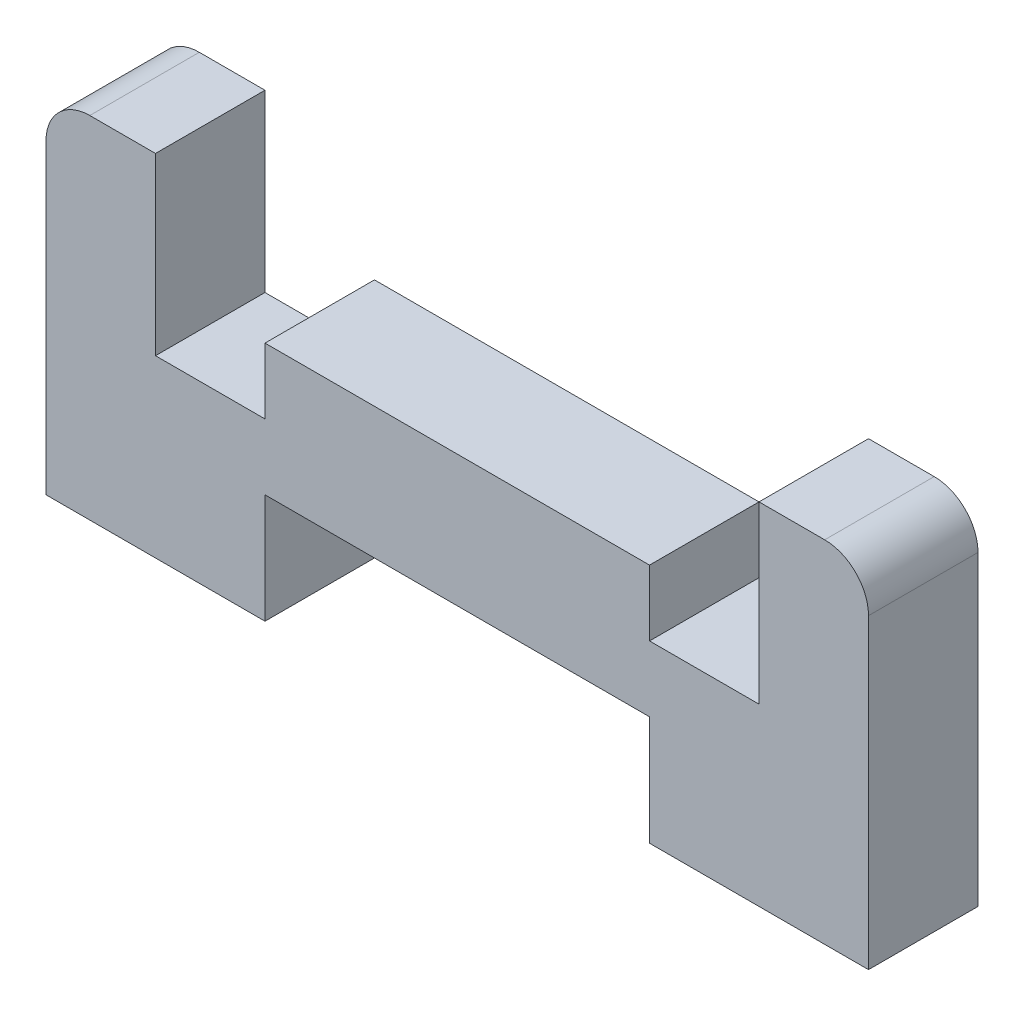
ISO-10303-21;
HEADER;
FILE_DESCRIPTION(('STEP AP214'),'2;1');
FILE_NAME('part.step','',(''),(''),'','','');
FILE_SCHEMA(('AUTOMOTIVE_DESIGN { 1 0 10303 214 1 1 1 1 }'));
ENDSEC;
DATA;
#1=APPLICATION_CONTEXT('core data for automotive mechanical design processes');
#2=APPLICATION_PROTOCOL_DEFINITION('international standard','automotive_design',2000,#1);
#3=PRODUCT_CONTEXT('',#1,'mechanical');
#4=PRODUCT('Part','Part','',(#3));
#5=PRODUCT_RELATED_PRODUCT_CATEGORY('part','',(#4));
#6=PRODUCT_DEFINITION_FORMATION('','',#4);
#7=PRODUCT_DEFINITION_CONTEXT('part definition',#1,'design');
#8=PRODUCT_DEFINITION('design','',#6,#7);
#9=PRODUCT_DEFINITION_SHAPE('','',#8);
#10=(LENGTH_UNIT() NAMED_UNIT(*) SI_UNIT(.MILLI.,.METRE.));
#11=(NAMED_UNIT(*) PLANE_ANGLE_UNIT() SI_UNIT($,.RADIAN.));
#12=(NAMED_UNIT(*) SI_UNIT($,.STERADIAN.) SOLID_ANGLE_UNIT());
#13=UNCERTAINTY_MEASURE_WITH_UNIT(LENGTH_MEASURE(1.E-05),#10,'distance_accuracy_value','');
#14=(GEOMETRIC_REPRESENTATION_CONTEXT(3) GLOBAL_UNCERTAINTY_ASSIGNED_CONTEXT((#13)) GLOBAL_UNIT_ASSIGNED_CONTEXT((#10,
#11,#12)) REPRESENTATION_CONTEXT('',''));
#15=CARTESIAN_POINT('',(0.,0.,0.));
#16=DIRECTION('',(0.,0.,1.));
#17=DIRECTION('',(1.,0.,0.));
#18=AXIS2_PLACEMENT_3D('',#15,#16,#17);
#19=CARTESIAN_POINT('',(-17.5006,0.,6.35));
#20=DIRECTION('',(-1.,0.,0.));
#21=DIRECTION('',(0.,-1.,0.));
#22=AXIS2_PLACEMENT_3D('',#19,#20,#21);
#23=PLANE('',#22);
#24=DIRECTION('',(0.,1.,0.));
#25=VECTOR('',#24,1.);
#26=CARTESIAN_POINT('',(-17.5006,0.,0.));
#27=LINE('',#26,#25);
#28=CARTESIAN_POINT('',(-17.5006,-3.81,0.));
#29=VERTEX_POINT('',#28);
#30=CARTESIAN_POINT('',(-17.5006,6.35,0.));
#31=VERTEX_POINT('',#30);
#32=EDGE_CURVE('E119',#29,#31,#27,.T.);
#33=ORIENTED_EDGE('',*,*,#32,.T.);
#34=DIRECTION('',(0.,0.,-1.));
#35=VECTOR('',#34,1.);
#36=CARTESIAN_POINT('',(-17.5006,6.35,6.35));
#37=LINE('',#36,#35);
#38=CARTESIAN_POINT('',(-17.5006,6.35,6.35));
#39=VERTEX_POINT('',#38);
#40=EDGE_CURVE('E11',#39,#31,#37,.T.);
#41=ORIENTED_EDGE('',*,*,#40,.F.);
#42=DIRECTION('',(0.,1.,0.));
#43=VECTOR('',#42,1.);
#44=CARTESIAN_POINT('',(-17.5006,0.,6.35));
#45=LINE('',#44,#43);
#46=CARTESIAN_POINT('',(-17.5006,-3.81,6.35));
#47=VERTEX_POINT('',#46);
#48=EDGE_CURVE('E125',#47,#39,#45,.T.);
#49=ORIENTED_EDGE('',*,*,#48,.F.);
#50=DIRECTION('',(0.,0.,-1.));
#51=VECTOR('',#50,1.);
#52=CARTESIAN_POINT('',(-17.5006,-3.81,6.35));
#53=LINE('',#52,#51);
#54=EDGE_CURVE('E189',#47,#29,#53,.T.);
#55=ORIENTED_EDGE('',*,*,#54,.T.);
#56=EDGE_LOOP('',(#33,#41,#49,#55));
#57=FACE_BOUND('',#56,.T.);
#58=ADVANCED_FACE('F37',(#57),#23,.F.);
#59=CARTESIAN_POINT('',(-17.5006,6.35,6.35));
#60=DIRECTION('',(0.,-1.,0.));
#61=DIRECTION('',(1.,0.,0.));
#62=AXIS2_PLACEMENT_3D('',#59,#60,#61);
#63=PLANE('',#62);
#64=DIRECTION('',(-1.,0.,0.));
#65=VECTOR('',#64,1.);
#66=CARTESIAN_POINT('',(-17.5006,6.35,0.));
#67=LINE('',#66,#65);
#68=CARTESIAN_POINT('',(-21.3106,6.35,0.));
#69=VERTEX_POINT('',#68);
#70=EDGE_CURVE('E194',#31,#69,#67,.T.);
#71=ORIENTED_EDGE('',*,*,#70,.T.);
#72=DIRECTION('',(0.,0.,-1.));
#73=VECTOR('',#72,1.);
#74=CARTESIAN_POINT('',(-21.3106,6.35,6.35));
#75=LINE('',#74,#73);
#76=CARTESIAN_POINT('',(-21.3106,6.35,6.35));
#77=VERTEX_POINT('',#76);
#78=EDGE_CURVE('E45',#77,#69,#75,.T.);
#79=ORIENTED_EDGE('',*,*,#78,.F.);
#80=DIRECTION('',(-1.,0.,0.));
#81=VECTOR('',#80,1.);
#82=CARTESIAN_POINT('',(-17.5006,6.35,6.35));
#83=LINE('',#82,#81);
#84=EDGE_CURVE('E326',#39,#77,#83,.T.);
#85=ORIENTED_EDGE('',*,*,#84,.F.);
#86=ORIENTED_EDGE('',*,*,#40,.T.);
#87=EDGE_LOOP('',(#71,#79,#85,#86));
#88=FACE_BOUND('',#87,.T.);
#89=ADVANCED_FACE('F329',(#88),#63,.F.);
#90=CARTESIAN_POINT('',(-21.3106,3.81,6.35));
#91=DIRECTION('',(0.,0.,-1.));
#92=DIRECTION('',(-1.,0.,0.));
#93=AXIS2_PLACEMENT_3D('',#90,#91,#92);
#94=CYLINDRICAL_SURFACE('',#93,2.54);
#95=CARTESIAN_POINT('',(-21.3106,3.81,0.));
#96=DIRECTION('',(0.,0.,1.));
#97=DIRECTION('',(1.,0.,0.));
#98=AXIS2_PLACEMENT_3D('',#95,#96,#97);
#99=CIRCLE('',#98,2.54);
#100=CARTESIAN_POINT('',(-23.8506,3.81,0.));
#101=VERTEX_POINT('',#100);
#102=EDGE_CURVE('E196',#69,#101,#99,.T.);
#103=ORIENTED_EDGE('',*,*,#102,.T.);
#104=DIRECTION('',(0.,0.,-1.));
#105=VECTOR('',#104,1.);
#106=CARTESIAN_POINT('',(-23.8506,3.81,6.35));
#107=LINE('',#106,#105);
#108=CARTESIAN_POINT('',(-23.8506,3.81,6.35));
#109=VERTEX_POINT('',#108);
#110=EDGE_CURVE('E266',#109,#101,#107,.T.);
#111=ORIENTED_EDGE('',*,*,#110,.F.);
#112=CARTESIAN_POINT('',(-21.3106,3.81,6.35));
#113=DIRECTION('',(0.,0.,1.));
#114=DIRECTION('',(1.,0.,0.));
#115=AXIS2_PLACEMENT_3D('',#112,#113,#114);
#116=CIRCLE('',#115,2.54);
#117=EDGE_CURVE('E275',#77,#109,#116,.T.);
#118=ORIENTED_EDGE('',*,*,#117,.F.);
#119=ORIENTED_EDGE('',*,*,#78,.T.);
#120=EDGE_LOOP('',(#103,#111,#118,#119));
#121=FACE_BOUND('',#120,.T.);
#122=ADVANCED_FACE('F273',(#121),#94,.T.);
#123=CARTESIAN_POINT('',(-23.8506,-7.61999999999999,6.35));
#124=DIRECTION('',(1.,0.,0.));
#125=DIRECTION('',(0.,1.,0.));
#126=AXIS2_PLACEMENT_3D('',#123,#124,#125);
#127=PLANE('',#126);
#128=DIRECTION('',(0.,-1.,0.));
#129=VECTOR('',#128,1.);
#130=CARTESIAN_POINT('',(-23.8506,-7.61999999999999,0.));
#131=LINE('',#130,#129);
#132=CARTESIAN_POINT('',(-23.8506,-13.97,0.));
#133=VERTEX_POINT('',#132);
#134=EDGE_CURVE('E199',#101,#133,#131,.T.);
#135=ORIENTED_EDGE('',*,*,#134,.T.);
#136=DIRECTION('',(0.,0.,-1.));
#137=VECTOR('',#136,1.);
#138=CARTESIAN_POINT('',(-23.8506,-13.97,6.35));
#139=LINE('',#138,#137);
#140=CARTESIAN_POINT('',(-23.8506,-13.97,6.35));
#141=VERTEX_POINT('',#140);
#142=EDGE_CURVE('E263',#141,#133,#139,.T.);
#143=ORIENTED_EDGE('',*,*,#142,.F.);
#144=DIRECTION('',(0.,-1.,0.));
#145=VECTOR('',#144,1.);
#146=CARTESIAN_POINT('',(-23.8506,3.81,6.35));
#147=LINE('',#146,#145);
#148=EDGE_CURVE('E292',#109,#141,#147,.T.);
#149=ORIENTED_EDGE('',*,*,#148,.F.);
#150=ORIENTED_EDGE('',*,*,#110,.T.);
#151=EDGE_LOOP('',(#135,#143,#149,#150));
#152=FACE_BOUND('',#151,.T.);
#153=ADVANCED_FACE('F283',(#152),#127,.F.);
#154=CARTESIAN_POINT('',(-23.8506,-13.97,6.35));
#155=DIRECTION('',(0.,1.,0.));
#156=DIRECTION('',(0.,0.,1.));
#157=AXIS2_PLACEMENT_3D('',#154,#155,#156);
#158=PLANE('',#157);
#159=DIRECTION('',(1.,0.,0.));
#160=VECTOR('',#159,1.);
#161=CARTESIAN_POINT('',(-23.8506,-13.97,0.));
#162=LINE('',#161,#160);
#163=CARTESIAN_POINT('',(-11.1506,-13.97,0.));
#164=VERTEX_POINT('',#163);
#165=EDGE_CURVE('E201',#133,#164,#162,.T.);
#166=ORIENTED_EDGE('',*,*,#165,.T.);
#167=DIRECTION('',(0.,0.,-1.));
#168=VECTOR('',#167,1.);
#169=CARTESIAN_POINT('',(-11.1506,-13.97,6.35));
#170=LINE('',#169,#168);
#171=CARTESIAN_POINT('',(-11.1506,-13.97,6.35));
#172=VERTEX_POINT('',#171);
#173=EDGE_CURVE('E260',#172,#164,#170,.T.);
#174=ORIENTED_EDGE('',*,*,#173,.F.);
#175=DIRECTION('',(1.,0.,0.));
#176=VECTOR('',#175,1.);
#177=CARTESIAN_POINT('',(-23.8506,-13.97,6.35));
#178=LINE('',#177,#176);
#179=EDGE_CURVE('E289',#141,#172,#178,.T.);
#180=ORIENTED_EDGE('',*,*,#179,.F.);
#181=ORIENTED_EDGE('',*,*,#142,.T.);
#182=EDGE_LOOP('',(#166,#174,#180,#181));
#183=FACE_BOUND('',#182,.T.);
#184=ADVANCED_FACE('F287',(#183),#158,.F.);
#185=CARTESIAN_POINT('',(-11.1506,-13.97,6.35));
#186=DIRECTION('',(-1.,0.,0.));
#187=DIRECTION('',(0.,-1.,0.));
#188=AXIS2_PLACEMENT_3D('',#185,#186,#187);
#189=PLANE('',#188);
#190=DIRECTION('',(0.,1.,0.));
#191=VECTOR('',#190,1.);
#192=CARTESIAN_POINT('',(-11.1506,-13.97,0.));
#193=LINE('',#192,#191);
#194=CARTESIAN_POINT('',(-11.1506,-7.62000000000001,0.));
#195=VERTEX_POINT('',#194);
#196=EDGE_CURVE('E203',#164,#195,#193,.T.);
#197=ORIENTED_EDGE('',*,*,#196,.T.);
#198=DIRECTION('',(0.,0.,-1.));
#199=VECTOR('',#198,1.);
#200=CARTESIAN_POINT('',(-11.1506,-7.62000000000001,6.35));
#201=LINE('',#200,#199);
#202=CARTESIAN_POINT('',(-11.1506,-7.62000000000001,6.35));
#203=VERTEX_POINT('',#202);
#204=EDGE_CURVE('E257',#203,#195,#201,.T.);
#205=ORIENTED_EDGE('',*,*,#204,.F.);
#206=DIRECTION('',(0.,1.,0.));
#207=VECTOR('',#206,1.);
#208=CARTESIAN_POINT('',(-11.1506,-13.97,6.35));
#209=LINE('',#208,#207);
#210=EDGE_CURVE('E291',#172,#203,#209,.T.);
#211=ORIENTED_EDGE('',*,*,#210,.F.);
#212=ORIENTED_EDGE('',*,*,#173,.T.);
#213=EDGE_LOOP('',(#197,#205,#211,#212));
#214=FACE_BOUND('',#213,.T.);
#215=ADVANCED_FACE('F341',(#214),#189,.F.);
#216=CARTESIAN_POINT('',(-11.1506,-7.62000000000001,6.35));
#217=DIRECTION('',(0.,1.,0.));
#218=DIRECTION('',(-1.,0.,0.));
#219=AXIS2_PLACEMENT_3D('',#216,#217,#218);
#220=PLANE('',#219);
#221=DIRECTION('',(1.,0.,0.));
#222=VECTOR('',#221,1.);
#223=CARTESIAN_POINT('',(-11.1506,-7.62000000000001,0.));
#224=LINE('',#223,#222);
#225=CARTESIAN_POINT('',(11.1506,-7.62,0.));
#226=VERTEX_POINT('',#225);
#227=EDGE_CURVE('E205',#195,#226,#224,.T.);
#228=ORIENTED_EDGE('',*,*,#227,.T.);
#229=DIRECTION('',(0.,0.,-1.));
#230=VECTOR('',#229,1.);
#231=CARTESIAN_POINT('',(11.1506,-7.62,6.35));
#232=LINE('',#231,#230);
#233=CARTESIAN_POINT('',(11.1506,-7.62,6.35));
#234=VERTEX_POINT('',#233);
#235=EDGE_CURVE('E254',#234,#226,#232,.T.);
#236=ORIENTED_EDGE('',*,*,#235,.F.);
#237=DIRECTION('',(1.,0.,0.));
#238=VECTOR('',#237,1.);
#239=CARTESIAN_POINT('',(-11.1506,-7.62000000000001,6.35));
#240=LINE('',#239,#238);
#241=EDGE_CURVE('E294',#203,#234,#240,.T.);
#242=ORIENTED_EDGE('',*,*,#241,.F.);
#243=ORIENTED_EDGE('',*,*,#204,.T.);
#244=EDGE_LOOP('',(#228,#236,#242,#243));
#245=FACE_BOUND('',#244,.T.);
#246=ADVANCED_FACE('F344',(#245),#220,.F.);
#247=CARTESIAN_POINT('',(11.1506,-13.97,6.35));
#248=DIRECTION('',(1.,0.,0.));
#249=DIRECTION('',(0.,1.,0.));
#250=AXIS2_PLACEMENT_3D('',#247,#248,#249);
#251=PLANE('',#250);
#252=DIRECTION('',(0.,-1.,0.));
#253=VECTOR('',#252,1.);
#254=CARTESIAN_POINT('',(11.1506,-13.97,0.));
#255=LINE('',#254,#253);
#256=CARTESIAN_POINT('',(11.1506,-13.97,0.));
#257=VERTEX_POINT('',#256);
#258=EDGE_CURVE('E207',#226,#257,#255,.T.);
#259=ORIENTED_EDGE('',*,*,#258,.T.);
#260=DIRECTION('',(0.,0.,-1.));
#261=VECTOR('',#260,1.);
#262=CARTESIAN_POINT('',(11.1506,-13.97,6.35));
#263=LINE('',#262,#261);
#264=CARTESIAN_POINT('',(11.1506,-13.97,6.35));
#265=VERTEX_POINT('',#264);
#266=EDGE_CURVE('E251',#265,#257,#263,.T.);
#267=ORIENTED_EDGE('',*,*,#266,.F.);
#268=DIRECTION('',(0.,-1.,0.));
#269=VECTOR('',#268,1.);
#270=CARTESIAN_POINT('',(11.1506,-13.97,6.35));
#271=LINE('',#270,#269);
#272=EDGE_CURVE('E300',#234,#265,#271,.T.);
#273=ORIENTED_EDGE('',*,*,#272,.F.);
#274=ORIENTED_EDGE('',*,*,#235,.T.);
#275=EDGE_LOOP('',(#259,#267,#273,#274));
#276=FACE_BOUND('',#275,.T.);
#277=ADVANCED_FACE('F348',(#276),#251,.F.);
#278=CARTESIAN_POINT('',(11.1506,-13.97,6.35));
#279=DIRECTION('',(0.,1.,0.));
#280=DIRECTION('',(0.,0.,1.));
#281=AXIS2_PLACEMENT_3D('',#278,#279,#280);
#282=PLANE('',#281);
#283=DIRECTION('',(1.,0.,0.));
#284=VECTOR('',#283,1.);
#285=CARTESIAN_POINT('',(11.1506,-13.97,0.));
#286=LINE('',#285,#284);
#287=CARTESIAN_POINT('',(23.8506,-13.97,0.));
#288=VERTEX_POINT('',#287);
#289=EDGE_CURVE('E209',#257,#288,#286,.T.);
#290=ORIENTED_EDGE('',*,*,#289,.T.);
#291=DIRECTION('',(0.,0.,-1.));
#292=VECTOR('',#291,1.);
#293=CARTESIAN_POINT('',(23.8506,-13.97,6.35));
#294=LINE('',#293,#292);
#295=CARTESIAN_POINT('',(23.8506,-13.97,6.35));
#296=VERTEX_POINT('',#295);
#297=EDGE_CURVE('E248',#296,#288,#294,.T.);
#298=ORIENTED_EDGE('',*,*,#297,.F.);
#299=DIRECTION('',(1.,0.,0.));
#300=VECTOR('',#299,1.);
#301=CARTESIAN_POINT('',(11.1506,-13.97,6.35));
#302=LINE('',#301,#300);
#303=EDGE_CURVE('E302',#265,#296,#302,.T.);
#304=ORIENTED_EDGE('',*,*,#303,.F.);
#305=ORIENTED_EDGE('',*,*,#266,.T.);
#306=EDGE_LOOP('',(#290,#298,#304,#305));
#307=FACE_BOUND('',#306,.T.);
#308=ADVANCED_FACE('F352',(#307),#282,.F.);
#309=CARTESIAN_POINT('',(23.8506,3.81000000000001,6.35));
#310=DIRECTION('',(-1.,0.,0.));
#311=DIRECTION('',(0.,-1.,0.));
#312=AXIS2_PLACEMENT_3D('',#309,#310,#311);
#313=PLANE('',#312);
#314=DIRECTION('',(0.,1.,0.));
#315=VECTOR('',#314,1.);
#316=CARTESIAN_POINT('',(23.8506,3.81000000000001,0.));
#317=LINE('',#316,#315);
#318=CARTESIAN_POINT('',(23.8506,3.81000000000001,0.));
#319=VERTEX_POINT('',#318);
#320=EDGE_CURVE('E212',#288,#319,#317,.T.);
#321=ORIENTED_EDGE('',*,*,#320,.T.);
#322=DIRECTION('',(0.,0.,-1.));
#323=VECTOR('',#322,1.);
#324=CARTESIAN_POINT('',(23.8506,3.81000000000001,6.35));
#325=LINE('',#324,#323);
#326=CARTESIAN_POINT('',(23.8506,3.81000000000001,6.35));
#327=VERTEX_POINT('',#326);
#328=EDGE_CURVE('E245',#327,#319,#325,.T.);
#329=ORIENTED_EDGE('',*,*,#328,.F.);
#330=DIRECTION('',(0.,1.,0.));
#331=VECTOR('',#330,1.);
#332=CARTESIAN_POINT('',(23.8506,-7.61999999999998,6.35));
#333=LINE('',#332,#331);
#334=EDGE_CURVE('E304',#296,#327,#333,.T.);
#335=ORIENTED_EDGE('',*,*,#334,.F.);
#336=ORIENTED_EDGE('',*,*,#297,.T.);
#337=EDGE_LOOP('',(#321,#329,#335,#336));
#338=FACE_BOUND('',#337,.T.);
#339=ADVANCED_FACE('F356',(#338),#313,.F.);
#340=CARTESIAN_POINT('',(21.3106,3.81000000000001,6.35));
#341=DIRECTION('',(0.,0.,-1.));
#342=DIRECTION('',(-1.,0.,0.));
#343=AXIS2_PLACEMENT_3D('',#340,#341,#342);
#344=CYLINDRICAL_SURFACE('',#343,2.54);
#345=CARTESIAN_POINT('',(21.3106,3.81000000000001,0.));
#346=DIRECTION('',(0.,0.,1.));
#347=DIRECTION('',(-1.,0.,0.));
#348=AXIS2_PLACEMENT_3D('',#345,#346,#347);
#349=CIRCLE('',#348,2.54);
#350=CARTESIAN_POINT('',(21.3106,6.35000000000001,0.));
#351=VERTEX_POINT('',#350);
#352=EDGE_CURVE('E214',#319,#351,#349,.T.);
#353=ORIENTED_EDGE('',*,*,#352,.T.);
#354=DIRECTION('',(0.,0.,-1.));
#355=VECTOR('',#354,1.);
#356=CARTESIAN_POINT('',(21.3106,6.35000000000001,6.35));
#357=LINE('',#356,#355);
#358=CARTESIAN_POINT('',(21.3106,6.35000000000001,6.35));
#359=VERTEX_POINT('',#358);
#360=EDGE_CURVE('E242',#359,#351,#357,.T.);
#361=ORIENTED_EDGE('',*,*,#360,.F.);
#362=CARTESIAN_POINT('',(21.3106,3.81000000000001,6.35));
#363=DIRECTION('',(0.,0.,1.));
#364=DIRECTION('',(-1.,0.,0.));
#365=AXIS2_PLACEMENT_3D('',#362,#363,#364);
#366=CIRCLE('',#365,2.54);
#367=EDGE_CURVE('E306',#327,#359,#366,.T.);
#368=ORIENTED_EDGE('',*,*,#367,.F.);
#369=ORIENTED_EDGE('',*,*,#328,.T.);
#370=EDGE_LOOP('',(#353,#361,#368,#369));
#371=FACE_BOUND('',#370,.T.);
#372=ADVANCED_FACE('F360',(#371),#344,.T.);
#373=CARTESIAN_POINT('',(17.5006,6.35000000000001,6.35));
#374=DIRECTION('',(0.,-1.,0.));
#375=DIRECTION('',(1.,0.,0.));
#376=AXIS2_PLACEMENT_3D('',#373,#374,#375);
#377=PLANE('',#376);
#378=DIRECTION('',(-1.,0.,0.));
#379=VECTOR('',#378,1.);
#380=CARTESIAN_POINT('',(17.5006,6.35000000000001,0.));
#381=LINE('',#380,#379);
#382=CARTESIAN_POINT('',(17.5006,6.35000000000001,0.));
#383=VERTEX_POINT('',#382);
#384=EDGE_CURVE('E216',#351,#383,#381,.T.);
#385=ORIENTED_EDGE('',*,*,#384,.T.);
#386=DIRECTION('',(0.,0.,-1.));
#387=VECTOR('',#386,1.);
#388=CARTESIAN_POINT('',(17.5006,6.35000000000001,6.35));
#389=LINE('',#388,#387);
#390=CARTESIAN_POINT('',(17.5006,6.35000000000001,6.35));
#391=VERTEX_POINT('',#390);
#392=EDGE_CURVE('E239',#391,#383,#389,.T.);
#393=ORIENTED_EDGE('',*,*,#392,.F.);
#394=DIRECTION('',(-1.,0.,0.));
#395=VECTOR('',#394,1.);
#396=CARTESIAN_POINT('',(17.5006,6.35000000000001,6.35));
#397=LINE('',#396,#395);
#398=EDGE_CURVE('E308',#359,#391,#397,.T.);
#399=ORIENTED_EDGE('',*,*,#398,.F.);
#400=ORIENTED_EDGE('',*,*,#360,.T.);
#401=EDGE_LOOP('',(#385,#393,#399,#400));
#402=FACE_BOUND('',#401,.T.);
#403=ADVANCED_FACE('F364',(#402),#377,.F.);
#404=CARTESIAN_POINT('',(17.5006,0.,6.35));
#405=DIRECTION('',(1.,0.,0.));
#406=DIRECTION('',(0.,1.,0.));
#407=AXIS2_PLACEMENT_3D('',#404,#405,#406);
#408=PLANE('',#407);
#409=DIRECTION('',(0.,-1.,0.));
#410=VECTOR('',#409,1.);
#411=CARTESIAN_POINT('',(17.5006,0.,0.));
#412=LINE('',#411,#410);
#413=CARTESIAN_POINT('',(17.5006,-3.80999999999997,0.));
#414=VERTEX_POINT('',#413);
#415=EDGE_CURVE('E219',#383,#414,#412,.T.);
#416=ORIENTED_EDGE('',*,*,#415,.T.);
#417=DIRECTION('',(0.,0.,-1.));
#418=VECTOR('',#417,1.);
#419=CARTESIAN_POINT('',(17.5006,-3.80999999999997,6.35));
#420=LINE('',#419,#418);
#421=CARTESIAN_POINT('',(17.5006,-3.80999999999997,6.35));
#422=VERTEX_POINT('',#421);
#423=EDGE_CURVE('E236',#422,#414,#420,.T.);
#424=ORIENTED_EDGE('',*,*,#423,.F.);
#425=DIRECTION('',(0.,-1.,0.));
#426=VECTOR('',#425,1.);
#427=CARTESIAN_POINT('',(17.5006,0.,6.35));
#428=LINE('',#427,#426);
#429=EDGE_CURVE('E310',#391,#422,#428,.T.);
#430=ORIENTED_EDGE('',*,*,#429,.F.);
#431=ORIENTED_EDGE('',*,*,#392,.T.);
#432=EDGE_LOOP('',(#416,#424,#430,#431));
#433=FACE_BOUND('',#432,.T.);
#434=ADVANCED_FACE('F368',(#433),#408,.F.);
#435=CARTESIAN_POINT('',(17.5006,-3.80999999999997,6.35));
#436=DIRECTION('',(0.,-1.,0.));
#437=DIRECTION('',(1.,0.,0.));
#438=AXIS2_PLACEMENT_3D('',#435,#436,#437);
#439=PLANE('',#438);
#440=DIRECTION('',(-1.,0.,0.));
#441=VECTOR('',#440,1.);
#442=CARTESIAN_POINT('',(17.5006,-3.80999999999997,0.));
#443=LINE('',#442,#441);
#444=CARTESIAN_POINT('',(11.1506,-3.80999999999994,0.));
#445=VERTEX_POINT('',#444);
#446=EDGE_CURVE('E221',#414,#445,#443,.T.);
#447=ORIENTED_EDGE('',*,*,#446,.T.);
#448=DIRECTION('',(0.,0.,-1.));
#449=VECTOR('',#448,1.);
#450=CARTESIAN_POINT('',(11.1506,-3.80999999999994,6.35));
#451=LINE('',#450,#449);
#452=CARTESIAN_POINT('',(11.1506,-3.80999999999994,6.35));
#453=VERTEX_POINT('',#452);
#454=EDGE_CURVE('E233',#453,#445,#451,.T.);
#455=ORIENTED_EDGE('',*,*,#454,.F.);
#456=DIRECTION('',(-1.,0.,0.));
#457=VECTOR('',#456,1.);
#458=CARTESIAN_POINT('',(17.5006,-3.80999999999997,6.35));
#459=LINE('',#458,#457);
#460=EDGE_CURVE('E312',#422,#453,#459,.T.);
#461=ORIENTED_EDGE('',*,*,#460,.F.);
#462=ORIENTED_EDGE('',*,*,#423,.T.);
#463=EDGE_LOOP('',(#447,#455,#461,#462));
#464=FACE_BOUND('',#463,.T.);
#465=ADVANCED_FACE('F318',(#464),#439,.F.);
#466=CARTESIAN_POINT('',(11.1506,-3.80999999999994,6.35));
#467=DIRECTION('',(-1.,0.,0.));
#468=DIRECTION('',(0.,-1.,0.));
#469=AXIS2_PLACEMENT_3D('',#466,#467,#468);
#470=PLANE('',#469);
#471=DIRECTION('',(0.,1.,0.));
#472=VECTOR('',#471,1.);
#473=CARTESIAN_POINT('',(11.1506,-3.80999999999994,0.));
#474=LINE('',#473,#472);
#475=CARTESIAN_POINT('',(11.1506,0.,0.));
#476=VERTEX_POINT('',#475);
#477=EDGE_CURVE('E223',#445,#476,#474,.T.);
#478=ORIENTED_EDGE('',*,*,#477,.T.);
#479=DIRECTION('',(0.,0.,-1.));
#480=VECTOR('',#479,1.);
#481=CARTESIAN_POINT('',(11.1506,0.,6.35));
#482=LINE('',#481,#480);
#483=CARTESIAN_POINT('',(11.1506,0.,6.35));
#484=VERTEX_POINT('',#483);
#485=EDGE_CURVE('E184',#484,#476,#482,.T.);
#486=ORIENTED_EDGE('',*,*,#485,.F.);
#487=DIRECTION('',(0.,1.,0.));
#488=VECTOR('',#487,1.);
#489=CARTESIAN_POINT('',(11.1506,-3.80999999999994,6.35));
#490=LINE('',#489,#488);
#491=EDGE_CURVE('E175',#453,#484,#490,.T.);
#492=ORIENTED_EDGE('',*,*,#491,.F.);
#493=ORIENTED_EDGE('',*,*,#454,.T.);
#494=EDGE_LOOP('',(#478,#486,#492,#493));
#495=FACE_BOUND('',#494,.T.);
#496=ADVANCED_FACE('F322',(#495),#470,.F.);
#497=CARTESIAN_POINT('',(-11.1506,0.,6.35));
#498=DIRECTION('',(0.,-1.,0.));
#499=DIRECTION('',(1.,0.,0.));
#500=AXIS2_PLACEMENT_3D('',#497,#498,#499);
#501=PLANE('',#500);
#502=DIRECTION('',(-1.,0.,0.));
#503=VECTOR('',#502,1.);
#504=CARTESIAN_POINT('',(-11.1506,0.,0.));
#505=LINE('',#504,#503);
#506=CARTESIAN_POINT('',(-11.1506,0.,0.));
#507=VERTEX_POINT('',#506);
#508=EDGE_CURVE('E183',#476,#507,#505,.T.);
#509=ORIENTED_EDGE('',*,*,#508,.T.);
#510=DIRECTION('',(0.,0.,-1.));
#511=VECTOR('',#510,1.);
#512=CARTESIAN_POINT('',(-11.1506,0.,6.35));
#513=LINE('',#512,#511);
#514=CARTESIAN_POINT('',(-11.1506,0.,6.35));
#515=VERTEX_POINT('',#514);
#516=EDGE_CURVE('E180',#515,#507,#513,.T.);
#517=ORIENTED_EDGE('',*,*,#516,.F.);
#518=DIRECTION('',(-1.,0.,0.));
#519=VECTOR('',#518,1.);
#520=CARTESIAN_POINT('',(-11.1506,0.,6.35));
#521=LINE('',#520,#519);
#522=EDGE_CURVE('E169',#484,#515,#521,.T.);
#523=ORIENTED_EDGE('',*,*,#522,.F.);
#524=ORIENTED_EDGE('',*,*,#485,.T.);
#525=EDGE_LOOP('',(#509,#517,#523,#524));
#526=FACE_BOUND('',#525,.T.);
#527=ADVANCED_FACE('F181',(#526),#501,.F.);
#528=CARTESIAN_POINT('',(-11.1506,-3.81,6.35));
#529=DIRECTION('',(1.,0.,0.));
#530=DIRECTION('',(0.,1.,0.));
#531=AXIS2_PLACEMENT_3D('',#528,#529,#530);
#532=PLANE('',#531);
#533=DIRECTION('',(0.,-1.,0.));
#534=VECTOR('',#533,1.);
#535=CARTESIAN_POINT('',(-11.1506,-3.81,0.));
#536=LINE('',#535,#534);
#537=CARTESIAN_POINT('',(-11.1506,-3.81,0.));
#538=VERTEX_POINT('',#537);
#539=EDGE_CURVE('E112',#507,#538,#536,.T.);
#540=ORIENTED_EDGE('',*,*,#539,.T.);
#541=DIRECTION('',(0.,0.,-1.));
#542=VECTOR('',#541,1.);
#543=CARTESIAN_POINT('',(-11.1506,-3.81,6.35));
#544=LINE('',#543,#542);
#545=CARTESIAN_POINT('',(-11.1506,-3.81,6.35));
#546=VERTEX_POINT('',#545);
#547=EDGE_CURVE('E185',#546,#538,#544,.T.);
#548=ORIENTED_EDGE('',*,*,#547,.F.);
#549=DIRECTION('',(0.,-1.,0.));
#550=VECTOR('',#549,1.);
#551=CARTESIAN_POINT('',(-11.1506,-3.81,6.35));
#552=LINE('',#551,#550);
#553=EDGE_CURVE('E173',#515,#546,#552,.T.);
#554=ORIENTED_EDGE('',*,*,#553,.F.);
#555=ORIENTED_EDGE('',*,*,#516,.T.);
#556=EDGE_LOOP('',(#540,#548,#554,#555));
#557=FACE_BOUND('',#556,.T.);
#558=ADVANCED_FACE('F187',(#557),#532,.F.);
#559=CARTESIAN_POINT('',(-17.5006,-3.81,6.35));
#560=DIRECTION('',(0.,-1.,0.));
#561=DIRECTION('',(0.,0.,-1.));
#562=AXIS2_PLACEMENT_3D('',#559,#560,#561);
#563=PLANE('',#562);
#564=DIRECTION('',(-1.,0.,0.));
#565=VECTOR('',#564,1.);
#566=CARTESIAN_POINT('',(-17.5006,-3.81,0.));
#567=LINE('',#566,#565);
#568=EDGE_CURVE('E227',#538,#29,#567,.T.);
#569=ORIENTED_EDGE('',*,*,#568,.T.);
#570=ORIENTED_EDGE('',*,*,#54,.F.);
#571=DIRECTION('',(-1.,0.,0.));
#572=VECTOR('',#571,1.);
#573=CARTESIAN_POINT('',(-17.5006,-3.81,6.35));
#574=LINE('',#573,#572);
#575=EDGE_CURVE('E53',#546,#47,#574,.T.);
#576=ORIENTED_EDGE('',*,*,#575,.F.);
#577=ORIENTED_EDGE('',*,*,#547,.T.);
#578=EDGE_LOOP('',(#569,#570,#576,#577));
#579=FACE_BOUND('',#578,.T.);
#580=ADVANCED_FACE('F324',(#579),#563,.F.);
#581=CARTESIAN_POINT('',(21.3106,3.81000000000001,6.35));
#582=DIRECTION('',(0.,0.,-1.));
#583=DIRECTION('',(-1.,0.,0.));
#584=AXIS2_PLACEMENT_3D('',#581,#582,#583);
#585=PLANE('',#584);
#586=ORIENTED_EDGE('',*,*,#48,.T.);
#587=ORIENTED_EDGE('',*,*,#84,.T.);
#588=ORIENTED_EDGE('',*,*,#117,.T.);
#589=ORIENTED_EDGE('',*,*,#148,.T.);
#590=ORIENTED_EDGE('',*,*,#179,.T.);
#591=ORIENTED_EDGE('',*,*,#210,.T.);
#592=ORIENTED_EDGE('',*,*,#241,.T.);
#593=ORIENTED_EDGE('',*,*,#272,.T.);
#594=ORIENTED_EDGE('',*,*,#303,.T.);
#595=ORIENTED_EDGE('',*,*,#334,.T.);
#596=ORIENTED_EDGE('',*,*,#367,.T.);
#597=ORIENTED_EDGE('',*,*,#398,.T.);
#598=ORIENTED_EDGE('',*,*,#429,.T.);
#599=ORIENTED_EDGE('',*,*,#460,.T.);
#600=ORIENTED_EDGE('',*,*,#491,.T.);
#601=ORIENTED_EDGE('',*,*,#522,.T.);
#602=ORIENTED_EDGE('',*,*,#553,.T.);
#603=ORIENTED_EDGE('',*,*,#575,.T.);
#604=EDGE_LOOP('',(#586,#587,#588,#589,#590,#591,#592,#593,#594,#595,#596,#597,#598,#599,#600,
#601,#602,#603));
#605=FACE_BOUND('',#604,.T.);
#606=ADVANCED_FACE('F171',(#605),#585,.F.);
#607=CARTESIAN_POINT('',(21.3106,3.81000000000001,0.));
#608=DIRECTION('',(0.,0.,-1.));
#609=DIRECTION('',(-1.,0.,0.));
#610=AXIS2_PLACEMENT_3D('',#607,#608,#609);
#611=PLANE('',#610);
#612=ORIENTED_EDGE('',*,*,#32,.F.);
#613=ORIENTED_EDGE('',*,*,#568,.F.);
#614=ORIENTED_EDGE('',*,*,#539,.F.);
#615=ORIENTED_EDGE('',*,*,#508,.F.);
#616=ORIENTED_EDGE('',*,*,#477,.F.);
#617=ORIENTED_EDGE('',*,*,#446,.F.);
#618=ORIENTED_EDGE('',*,*,#415,.F.);
#619=ORIENTED_EDGE('',*,*,#384,.F.);
#620=ORIENTED_EDGE('',*,*,#352,.F.);
#621=ORIENTED_EDGE('',*,*,#320,.F.);
#622=ORIENTED_EDGE('',*,*,#289,.F.);
#623=ORIENTED_EDGE('',*,*,#258,.F.);
#624=ORIENTED_EDGE('',*,*,#227,.F.);
#625=ORIENTED_EDGE('',*,*,#196,.F.);
#626=ORIENTED_EDGE('',*,*,#165,.F.);
#627=ORIENTED_EDGE('',*,*,#134,.F.);
#628=ORIENTED_EDGE('',*,*,#102,.F.);
#629=ORIENTED_EDGE('',*,*,#70,.F.);
#630=EDGE_LOOP('',(#612,#613,#614,#615,#616,#617,#618,#619,#620,#621,#622,#623,#624,#625,#626,
#627,#628,#629));
#631=FACE_BOUND('',#630,.T.);
#632=ADVANCED_FACE('F278',(#631),#611,.T.);
#633=CLOSED_SHELL('',(#58,#89,#122,#153,#184,#215,#246,#277,#308,#339,#372,#403,#434,#465,#496,
#527,#558,#580,#606,#632));
#634=MANIFOLD_SOLID_BREP('B2',#633);
#635=ADVANCED_BREP_SHAPE_REPRESENTATION('',(#18,#634),#14);
#636=SHAPE_DEFINITION_REPRESENTATION(#9,#635);
ENDSEC;
END-ISO-10303-21;
